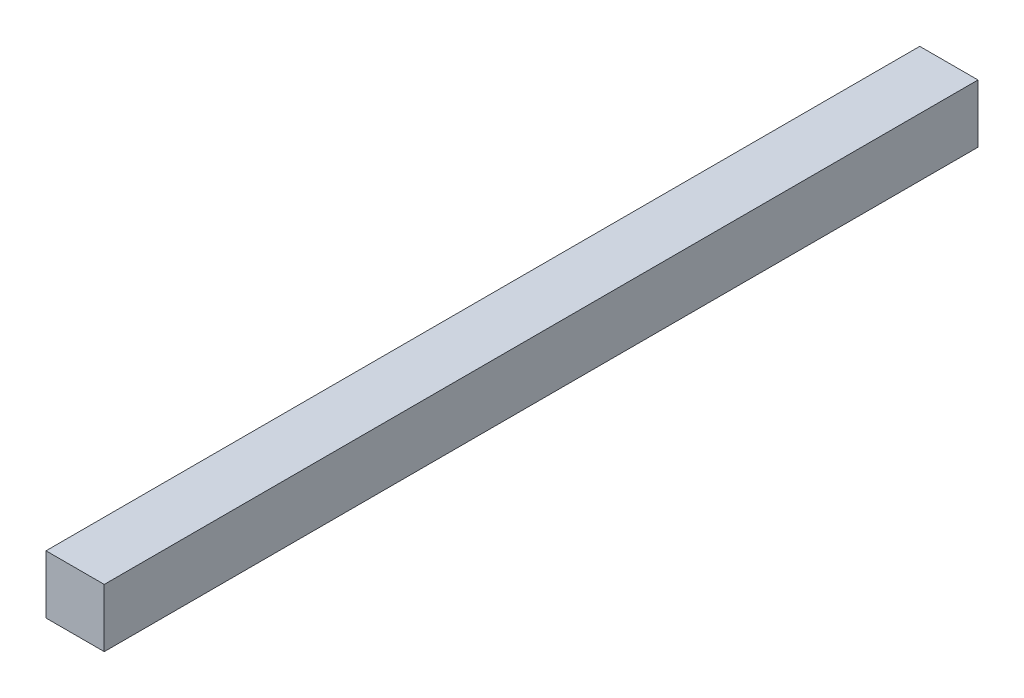
ISO-10303-21;
HEADER;
FILE_DESCRIPTION(('STEP AP214'),'2;1');
FILE_NAME('part.step','',(''),(''),'','','');
FILE_SCHEMA(('AUTOMOTIVE_DESIGN { 1 0 10303 214 1 1 1 1 }'));
ENDSEC;
DATA;
#1=APPLICATION_CONTEXT('core data for automotive mechanical design processes');
#2=APPLICATION_PROTOCOL_DEFINITION('international standard','automotive_design',2000,#1);
#3=PRODUCT_CONTEXT('',#1,'mechanical');
#4=PRODUCT('Part','Part','',(#3));
#5=PRODUCT_RELATED_PRODUCT_CATEGORY('part','',(#4));
#6=PRODUCT_DEFINITION_FORMATION('','',#4);
#7=PRODUCT_DEFINITION_CONTEXT('part definition',#1,'design');
#8=PRODUCT_DEFINITION('design','',#6,#7);
#9=PRODUCT_DEFINITION_SHAPE('','',#8);
#10=(LENGTH_UNIT() NAMED_UNIT(*) SI_UNIT(.MILLI.,.METRE.));
#11=(NAMED_UNIT(*) PLANE_ANGLE_UNIT() SI_UNIT($,.RADIAN.));
#12=(NAMED_UNIT(*) SI_UNIT($,.STERADIAN.) SOLID_ANGLE_UNIT());
#13=UNCERTAINTY_MEASURE_WITH_UNIT(LENGTH_MEASURE(1.E-05),#10,'distance_accuracy_value','');
#14=(GEOMETRIC_REPRESENTATION_CONTEXT(3) GLOBAL_UNCERTAINTY_ASSIGNED_CONTEXT((#13)) GLOBAL_UNIT_ASSIGNED_CONTEXT((#10,
#11,#12)) REPRESENTATION_CONTEXT('',''));
#15=CARTESIAN_POINT('',(0.,0.,0.));
#16=DIRECTION('',(0.,0.,1.));
#17=DIRECTION('',(1.,0.,0.));
#18=AXIS2_PLACEMENT_3D('',#15,#16,#17);
#19=CARTESIAN_POINT('',(-10.,10.,300.));
#20=DIRECTION('',(1.,0.,0.));
#21=DIRECTION('',(0.,1.,0.));
#22=AXIS2_PLACEMENT_3D('',#19,#20,#21);
#23=PLANE('',#22);
#24=DIRECTION('',(0.,-1.,0.));
#25=VECTOR('',#24,1.);
#26=CARTESIAN_POINT('',(-10.,10.,0.));
#27=LINE('',#26,#25);
#28=CARTESIAN_POINT('',(-10.,10.,0.));
#29=VERTEX_POINT('',#28);
#30=CARTESIAN_POINT('',(-10.,-10.,0.));
#31=VERTEX_POINT('',#30);
#32=EDGE_CURVE('E95',#29,#31,#27,.T.);
#33=ORIENTED_EDGE('',*,*,#32,.T.);
#34=DIRECTION('',(0.,0.,-1.));
#35=VECTOR('',#34,1.);
#36=CARTESIAN_POINT('',(-10.,-10.,300.));
#37=LINE('',#36,#35);
#38=CARTESIAN_POINT('',(-10.,-10.,300.));
#39=VERTEX_POINT('',#38);
#40=EDGE_CURVE('E11',#39,#31,#37,.T.);
#41=ORIENTED_EDGE('',*,*,#40,.F.);
#42=DIRECTION('',(0.,-1.,0.));
#43=VECTOR('',#42,1.);
#44=CARTESIAN_POINT('',(-10.,10.,300.));
#45=LINE('',#44,#43);
#46=CARTESIAN_POINT('',(-10.,10.,300.));
#47=VERTEX_POINT('',#46);
#48=EDGE_CURVE('E83',#47,#39,#45,.T.);
#49=ORIENTED_EDGE('',*,*,#48,.F.);
#50=DIRECTION('',(0.,0.,-1.));
#51=VECTOR('',#50,1.);
#52=CARTESIAN_POINT('',(-10.,10.,300.));
#53=LINE('',#52,#51);
#54=EDGE_CURVE('E91',#47,#29,#53,.T.);
#55=ORIENTED_EDGE('',*,*,#54,.T.);
#56=EDGE_LOOP('',(#33,#41,#49,#55));
#57=FACE_BOUND('',#56,.T.);
#58=ADVANCED_FACE('F32',(#57),#23,.F.);
#59=CARTESIAN_POINT('',(-10.,-10.,300.));
#60=DIRECTION('',(0.,1.,0.));
#61=DIRECTION('',(0.,0.,1.));
#62=AXIS2_PLACEMENT_3D('',#59,#60,#61);
#63=PLANE('',#62);
#64=DIRECTION('',(1.,0.,0.));
#65=VECTOR('',#64,1.);
#66=CARTESIAN_POINT('',(-10.,-10.,0.));
#67=LINE('',#66,#65);
#68=CARTESIAN_POINT('',(10.,-10.,0.));
#69=VERTEX_POINT('',#68);
#70=EDGE_CURVE('E87',#31,#69,#67,.T.);
#71=ORIENTED_EDGE('',*,*,#70,.T.);
#72=DIRECTION('',(0.,0.,-1.));
#73=VECTOR('',#72,1.);
#74=CARTESIAN_POINT('',(10.,-10.,300.));
#75=LINE('',#74,#73);
#76=CARTESIAN_POINT('',(10.,-10.,300.));
#77=VERTEX_POINT('',#76);
#78=EDGE_CURVE('E40',#77,#69,#75,.T.);
#79=ORIENTED_EDGE('',*,*,#78,.F.);
#80=DIRECTION('',(1.,0.,0.));
#81=VECTOR('',#80,1.);
#82=CARTESIAN_POINT('',(-10.,-10.,300.));
#83=LINE('',#82,#81);
#84=EDGE_CURVE('E78',#39,#77,#83,.T.);
#85=ORIENTED_EDGE('',*,*,#84,.F.);
#86=ORIENTED_EDGE('',*,*,#40,.T.);
#87=EDGE_LOOP('',(#71,#79,#85,#86));
#88=FACE_BOUND('',#87,.T.);
#89=ADVANCED_FACE('F86',(#88),#63,.F.);
#90=CARTESIAN_POINT('',(10.,10.,300.));
#91=DIRECTION('',(-1.,0.,0.));
#92=DIRECTION('',(0.,0.,1.));
#93=AXIS2_PLACEMENT_3D('',#90,#91,#92);
#94=PLANE('',#93);
#95=DIRECTION('',(0.,1.,0.));
#96=VECTOR('',#95,1.);
#97=CARTESIAN_POINT('',(10.,10.,0.));
#98=LINE('',#97,#96);
#99=CARTESIAN_POINT('',(10.,10.,0.));
#100=VERTEX_POINT('',#99);
#101=EDGE_CURVE('E65',#69,#100,#98,.T.);
#102=ORIENTED_EDGE('',*,*,#101,.T.);
#103=DIRECTION('',(0.,0.,-1.));
#104=VECTOR('',#103,1.);
#105=CARTESIAN_POINT('',(10.,10.,300.));
#106=LINE('',#105,#104);
#107=CARTESIAN_POINT('',(10.,10.,300.));
#108=VERTEX_POINT('',#107);
#109=EDGE_CURVE('E88',#108,#100,#106,.T.);
#110=ORIENTED_EDGE('',*,*,#109,.F.);
#111=DIRECTION('',(0.,1.,0.));
#112=VECTOR('',#111,1.);
#113=CARTESIAN_POINT('',(10.,10.,300.));
#114=LINE('',#113,#112);
#115=EDGE_CURVE('E81',#77,#108,#114,.T.);
#116=ORIENTED_EDGE('',*,*,#115,.F.);
#117=ORIENTED_EDGE('',*,*,#78,.T.);
#118=EDGE_LOOP('',(#102,#110,#116,#117));
#119=FACE_BOUND('',#118,.T.);
#120=ADVANCED_FACE('F89',(#119),#94,.F.);
#121=CARTESIAN_POINT('',(-10.,10.,300.));
#122=DIRECTION('',(0.,-1.,0.));
#123=DIRECTION('',(0.,0.,-1.));
#124=AXIS2_PLACEMENT_3D('',#121,#122,#123);
#125=PLANE('',#124);
#126=DIRECTION('',(-1.,0.,0.));
#127=VECTOR('',#126,1.);
#128=CARTESIAN_POINT('',(-10.,10.,0.));
#129=LINE('',#128,#127);
#130=EDGE_CURVE('E71',#100,#29,#129,.T.);
#131=ORIENTED_EDGE('',*,*,#130,.T.);
#132=ORIENTED_EDGE('',*,*,#54,.F.);
#133=DIRECTION('',(-1.,0.,0.));
#134=VECTOR('',#133,1.);
#135=CARTESIAN_POINT('',(-10.,10.,300.));
#136=LINE('',#135,#134);
#137=EDGE_CURVE('E48',#108,#47,#136,.T.);
#138=ORIENTED_EDGE('',*,*,#137,.F.);
#139=ORIENTED_EDGE('',*,*,#109,.T.);
#140=EDGE_LOOP('',(#131,#132,#138,#139));
#141=FACE_BOUND('',#140,.T.);
#142=ADVANCED_FACE('F102',(#141),#125,.F.);
#143=CARTESIAN_POINT('',(0.,0.,300.));
#144=DIRECTION('',(0.,0.,1.));
#145=DIRECTION('',(1.,0.,0.));
#146=AXIS2_PLACEMENT_3D('',#143,#144,#145);
#147=PLANE('',#146);
#148=ORIENTED_EDGE('',*,*,#48,.T.);
#149=ORIENTED_EDGE('',*,*,#84,.T.);
#150=ORIENTED_EDGE('',*,*,#115,.T.);
#151=ORIENTED_EDGE('',*,*,#137,.T.);
#152=EDGE_LOOP('',(#148,#149,#150,#151));
#153=FACE_BOUND('',#152,.T.);
#154=ADVANCED_FACE('F79',(#153),#147,.T.);
#155=CARTESIAN_POINT('',(0.,0.,0.));
#156=DIRECTION('',(0.,0.,1.));
#157=DIRECTION('',(1.,0.,0.));
#158=AXIS2_PLACEMENT_3D('',#155,#156,#157);
#159=PLANE('',#158);
#160=ORIENTED_EDGE('',*,*,#32,.F.);
#161=ORIENTED_EDGE('',*,*,#130,.F.);
#162=ORIENTED_EDGE('',*,*,#101,.F.);
#163=ORIENTED_EDGE('',*,*,#70,.F.);
#164=EDGE_LOOP('',(#160,#161,#162,#163));
#165=FACE_BOUND('',#164,.T.);
#166=ADVANCED_FACE('F105',(#165),#159,.F.);
#167=CLOSED_SHELL('',(#58,#89,#120,#142,#154,#166));
#168=MANIFOLD_SOLID_BREP('B2',#167);
#169=ADVANCED_BREP_SHAPE_REPRESENTATION('',(#18,#168),#14);
#170=SHAPE_DEFINITION_REPRESENTATION(#9,#169);
ENDSEC;
END-ISO-10303-21;
